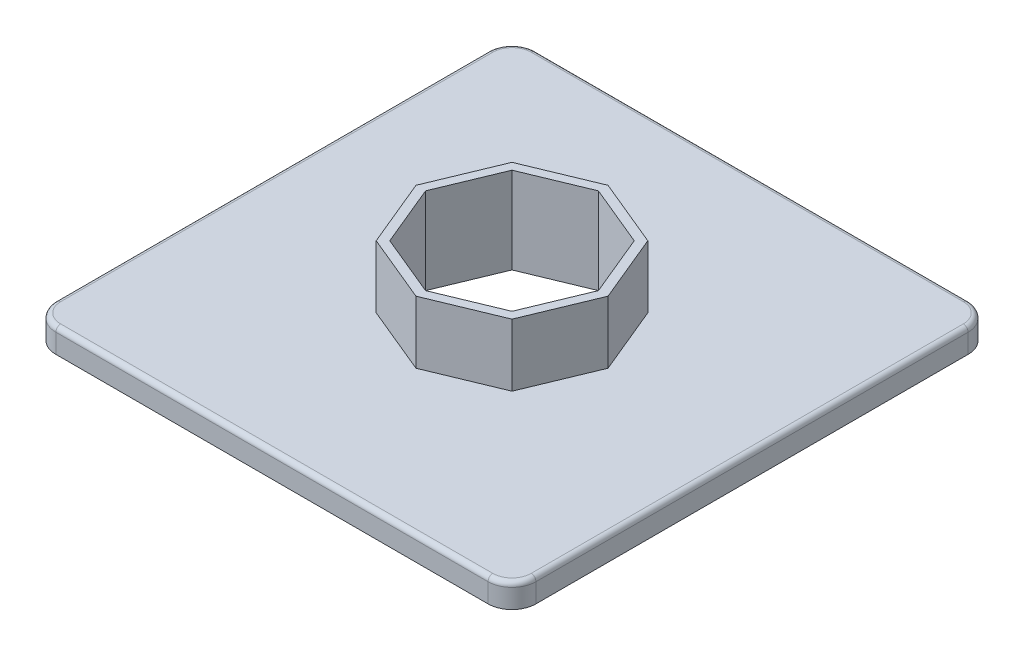
ISO-10303-21;
HEADER;
FILE_DESCRIPTION(('STEP AP214'),'2;1');
FILE_NAME('part.step','',(''),(''),'','','');
FILE_SCHEMA(('AUTOMOTIVE_DESIGN { 1 0 10303 214 1 1 1 1 }'));
ENDSEC;
DATA;
#1=APPLICATION_CONTEXT('core data for automotive mechanical design processes');
#2=APPLICATION_PROTOCOL_DEFINITION('international standard','automotive_design',2000,#1);
#3=PRODUCT_CONTEXT('',#1,'mechanical');
#4=PRODUCT('Part','Part','',(#3));
#5=PRODUCT_RELATED_PRODUCT_CATEGORY('part','',(#4));
#6=PRODUCT_DEFINITION_FORMATION('','',#4);
#7=PRODUCT_DEFINITION_CONTEXT('part definition',#1,'design');
#8=PRODUCT_DEFINITION('design','',#6,#7);
#9=PRODUCT_DEFINITION_SHAPE('','',#8);
#10=(LENGTH_UNIT() NAMED_UNIT(*) SI_UNIT(.MILLI.,.METRE.));
#11=(NAMED_UNIT(*) PLANE_ANGLE_UNIT() SI_UNIT($,.RADIAN.));
#12=(NAMED_UNIT(*) SI_UNIT($,.STERADIAN.) SOLID_ANGLE_UNIT());
#13=UNCERTAINTY_MEASURE_WITH_UNIT(LENGTH_MEASURE(1.E-05),#10,'distance_accuracy_value','');
#14=(GEOMETRIC_REPRESENTATION_CONTEXT(3) GLOBAL_UNCERTAINTY_ASSIGNED_CONTEXT((#13)) GLOBAL_UNIT_ASSIGNED_CONTEXT((#10,
#11,#12)) REPRESENTATION_CONTEXT('',''));
#15=CARTESIAN_POINT('',(0.,0.,0.));
#16=DIRECTION('',(0.,0.,1.));
#17=DIRECTION('',(1.,0.,0.));
#18=AXIS2_PLACEMENT_3D('',#15,#16,#17);
#19=CARTESIAN_POINT('',(95.,5.,-95.));
#20=DIRECTION('',(0.,1.,0.));
#21=DIRECTION('',(0.,0.,1.));
#22=AXIS2_PLACEMENT_3D('',#19,#20,#21);
#23=PLANE('',#22);
#24=CARTESIAN_POINT('',(5.,5.,-95.));
#25=DIRECTION('',(0.,1.,0.));
#26=DIRECTION('',(0.,0.,1.));
#27=AXIS2_PLACEMENT_3D('',#24,#25,#26);
#28=CIRCLE('',#27,4.);
#29=CARTESIAN_POINT('',(5.00000000000003,5.,-99.));
#30=VERTEX_POINT('',#29);
#31=CARTESIAN_POINT('',(0.999999999999997,5.,-95.));
#32=VERTEX_POINT('',#31);
#33=EDGE_CURVE('E402',#30,#32,#28,.T.);
#34=ORIENTED_EDGE('',*,*,#33,.T.);
#35=DIRECTION('',(0.,0.,1.));
#36=VECTOR('',#35,1.);
#37=CARTESIAN_POINT('',(1.,5.,-5.00000000000003));
#38=LINE('',#37,#36);
#39=CARTESIAN_POINT('',(1.,5.,-5.00000000000003));
#40=VERTEX_POINT('',#39);
#41=EDGE_CURVE('E401',#32,#40,#38,.T.);
#42=ORIENTED_EDGE('',*,*,#41,.T.);
#43=CARTESIAN_POINT('',(5.,5.,-5.));
#44=DIRECTION('',(0.,1.,0.));
#45=DIRECTION('',(0.,0.,1.));
#46=AXIS2_PLACEMENT_3D('',#43,#44,#45);
#47=CIRCLE('',#46,4.);
#48=CARTESIAN_POINT('',(5.00000000000004,5.,-1.));
#49=VERTEX_POINT('',#48);
#50=EDGE_CURVE('E386',#40,#49,#47,.T.);
#51=ORIENTED_EDGE('',*,*,#50,.T.);
#52=DIRECTION('',(1.,0.,0.));
#53=VECTOR('',#52,1.);
#54=CARTESIAN_POINT('',(95.,5.,-1.));
#55=LINE('',#54,#53);
#56=CARTESIAN_POINT('',(95.,5.,-1.));
#57=VERTEX_POINT('',#56);
#58=EDGE_CURVE('E391',#49,#57,#55,.T.);
#59=ORIENTED_EDGE('',*,*,#58,.T.);
#60=CARTESIAN_POINT('',(95.,5.,-5.));
#61=DIRECTION('',(0.,1.,0.));
#62=DIRECTION('',(0.,0.,1.));
#63=AXIS2_PLACEMENT_3D('',#60,#61,#62);
#64=CIRCLE('',#63,4.);
#65=CARTESIAN_POINT('',(99.,5.,-5.00000000000003));
#66=VERTEX_POINT('',#65);
#67=EDGE_CURVE('E394',#57,#66,#64,.T.);
#68=ORIENTED_EDGE('',*,*,#67,.T.);
#69=DIRECTION('',(0.,0.,-1.));
#70=VECTOR('',#69,1.);
#71=CARTESIAN_POINT('',(99.,5.,-95.));
#72=LINE('',#71,#70);
#73=CARTESIAN_POINT('',(99.,5.,-95.));
#74=VERTEX_POINT('',#73);
#75=EDGE_CURVE('E395',#66,#74,#72,.T.);
#76=ORIENTED_EDGE('',*,*,#75,.T.);
#77=CARTESIAN_POINT('',(95.,5.,-95.));
#78=DIRECTION('',(0.,1.,0.));
#79=DIRECTION('',(0.,0.,1.));
#80=AXIS2_PLACEMENT_3D('',#77,#78,#79);
#81=CIRCLE('',#80,4.);
#82=CARTESIAN_POINT('',(95.,5.,-99.));
#83=VERTEX_POINT('',#82);
#84=EDGE_CURVE('E396',#74,#83,#81,.T.);
#85=ORIENTED_EDGE('',*,*,#84,.T.);
#86=DIRECTION('',(-1.,0.,0.));
#87=VECTOR('',#86,1.);
#88=CARTESIAN_POINT('',(5.00000000000003,5.,-99.));
#89=LINE('',#88,#87);
#90=EDGE_CURVE('E398',#83,#30,#89,.T.);
#91=ORIENTED_EDGE('',*,*,#90,.T.);
#92=EDGE_LOOP('',(#34,#42,#51,#59,#68,#76,#85,#91));
#93=FACE_BOUND('',#92,.T.);
#94=DIRECTION('',(-0.3826834323651,0.,-0.923879532511283));
#95=VECTOR('',#94,1.);
#96=CARTESIAN_POINT('',(70.,5.,-50.0000000000002));
#97=LINE('',#96,#95);
#98=CARTESIAN_POINT('',(70.,5.,-50.0000000000002));
#99=VERTEX_POINT('',#98);
#100=CARTESIAN_POINT('',(64.1421356237308,5.,-64.1421356237311));
#101=VERTEX_POINT('',#100);
#102=EDGE_CURVE('E312',#99,#101,#97,.T.);
#103=ORIENTED_EDGE('',*,*,#102,.F.);
#104=DIRECTION('',(0.382683432365081,0.,-0.923879532511291));
#105=VECTOR('',#104,1.);
#106=CARTESIAN_POINT('',(64.1421356237311,5.,-35.8578643762692));
#107=LINE('',#106,#105);
#108=CARTESIAN_POINT('',(64.1421356237311,5.,-35.8578643762692));
#109=VERTEX_POINT('',#108);
#110=EDGE_CURVE('E237',#109,#99,#107,.T.);
#111=ORIENTED_EDGE('',*,*,#110,.F.);
#112=DIRECTION('',(0.923879532511283,0.,-0.3826834323651));
#113=VECTOR('',#112,1.);
#114=CARTESIAN_POINT('',(50.0000000000002,5.,-30.));
#115=LINE('',#114,#113);
#116=CARTESIAN_POINT('',(50.0000000000002,5.,-30.));
#117=VERTEX_POINT('',#116);
#118=EDGE_CURVE('E299',#117,#109,#115,.T.);
#119=ORIENTED_EDGE('',*,*,#118,.F.);
#120=DIRECTION('',(0.923879532511291,0.,0.382683432365079));
#121=VECTOR('',#120,1.);
#122=CARTESIAN_POINT('',(35.8578643762692,5.,-35.8578643762689));
#123=LINE('',#122,#121);
#124=CARTESIAN_POINT('',(35.8578643762692,5.,-35.8578643762689));
#125=VERTEX_POINT('',#124);
#126=EDGE_CURVE('E324',#125,#117,#123,.T.);
#127=ORIENTED_EDGE('',*,*,#126,.F.);
#128=DIRECTION('',(0.382683432365099,0.,0.923879532511283));
#129=VECTOR('',#128,1.);
#130=CARTESIAN_POINT('',(30.,5.,-49.9999999999998));
#131=LINE('',#130,#129);
#132=CARTESIAN_POINT('',(30.,5.,-49.9999999999998));
#133=VERTEX_POINT('',#132);
#134=EDGE_CURVE('E323',#133,#125,#131,.T.);
#135=ORIENTED_EDGE('',*,*,#134,.F.);
#136=DIRECTION('',(-0.38268343236508,0.,0.923879532511291));
#137=VECTOR('',#136,1.);
#138=CARTESIAN_POINT('',(35.8578643762689,5.,-64.1421356237308));
#139=LINE('',#138,#137);
#140=CARTESIAN_POINT('',(35.8578643762689,5.,-64.1421356237308));
#141=VERTEX_POINT('',#140);
#142=EDGE_CURVE('E321',#141,#133,#139,.T.);
#143=ORIENTED_EDGE('',*,*,#142,.F.);
#144=DIRECTION('',(-0.923879532511283,0.,0.382683432365099));
#145=VECTOR('',#144,1.);
#146=CARTESIAN_POINT('',(49.9999999999998,5.,-70.));
#147=LINE('',#146,#145);
#148=CARTESIAN_POINT('',(49.9999999999998,5.,-70.));
#149=VERTEX_POINT('',#148);
#150=EDGE_CURVE('E317',#149,#141,#147,.T.);
#151=ORIENTED_EDGE('',*,*,#150,.F.);
#152=DIRECTION('',(-0.923879532511291,0.,-0.38268343236508));
#153=VECTOR('',#152,1.);
#154=CARTESIAN_POINT('',(64.1421356237308,5.,-64.1421356237311));
#155=LINE('',#154,#153);
#156=EDGE_CURVE('E320',#101,#149,#155,.T.);
#157=ORIENTED_EDGE('',*,*,#156,.F.);
#158=EDGE_LOOP('',(#103,#111,#119,#127,#135,#143,#151,#157));
#159=FACE_BOUND('',#158,.T.);
#160=ADVANCED_FACE('F39',(#93,#159),#23,.T.);
#161=CARTESIAN_POINT('',(95.,5.,-95.));
#162=DIRECTION('',(0.,-1.,0.));
#163=DIRECTION('',(0.,0.,-1.));
#164=AXIS2_PLACEMENT_3D('',#161,#162,#163);
#165=CYLINDRICAL_SURFACE('',#164,5.);
#166=DIRECTION('',(0.,-1.,0.));
#167=VECTOR('',#166,1.);
#168=CARTESIAN_POINT('',(95.,5.,-100.));
#169=LINE('',#168,#167);
#170=CARTESIAN_POINT('',(95.,4.,-100.));
#171=VERTEX_POINT('',#170);
#172=CARTESIAN_POINT('',(95.,0.,-100.));
#173=VERTEX_POINT('',#172);
#174=EDGE_CURVE('E390',#171,#173,#169,.T.);
#175=ORIENTED_EDGE('',*,*,#174,.F.);
#176=CARTESIAN_POINT('',(95.,4.,-95.));
#177=DIRECTION('',(0.,1.,0.));
#178=DIRECTION('',(0.,0.,1.));
#179=AXIS2_PLACEMENT_3D('',#176,#177,#178);
#180=CIRCLE('',#179,5.);
#181=CARTESIAN_POINT('',(100.,4.,-95.));
#182=VERTEX_POINT('',#181);
#183=EDGE_CURVE('E415',#171,#182,#180,.F.);
#184=ORIENTED_EDGE('',*,*,#183,.T.);
#185=DIRECTION('',(0.,-1.,0.));
#186=VECTOR('',#185,1.);
#187=CARTESIAN_POINT('',(100.,5.,-95.));
#188=LINE('',#187,#186);
#189=CARTESIAN_POINT('',(100.,0.,-95.));
#190=VERTEX_POINT('',#189);
#191=EDGE_CURVE('E373',#182,#190,#188,.T.);
#192=ORIENTED_EDGE('',*,*,#191,.T.);
#193=CARTESIAN_POINT('',(95.,0.,-95.));
#194=DIRECTION('',(0.,1.,0.));
#195=DIRECTION('',(0.,0.,1.));
#196=AXIS2_PLACEMENT_3D('',#193,#194,#195);
#197=CIRCLE('',#196,5.);
#198=EDGE_CURVE('E349',#190,#173,#197,.T.);
#199=ORIENTED_EDGE('',*,*,#198,.T.);
#200=EDGE_LOOP('',(#175,#184,#192,#199));
#201=FACE_BOUND('',#200,.T.);
#202=ADVANCED_FACE('F465',(#201),#165,.T.);
#203=CARTESIAN_POINT('',(5.00000000000004,5.,-100.));
#204=DIRECTION('',(0.,0.,1.));
#205=DIRECTION('',(1.,0.,0.));
#206=AXIS2_PLACEMENT_3D('',#203,#204,#205);
#207=PLANE('',#206);
#208=DIRECTION('',(0.,-1.,0.));
#209=VECTOR('',#208,1.);
#210=CARTESIAN_POINT('',(5.00000000000004,5.,-100.));
#211=LINE('',#210,#209);
#212=CARTESIAN_POINT('',(5.00000000000004,4.,-100.));
#213=VERTEX_POINT('',#212);
#214=CARTESIAN_POINT('',(5.00000000000004,0.,-100.));
#215=VERTEX_POINT('',#214);
#216=EDGE_CURVE('E384',#213,#215,#211,.T.);
#217=ORIENTED_EDGE('',*,*,#216,.F.);
#218=DIRECTION('',(-1.,0.,0.));
#219=VECTOR('',#218,1.);
#220=CARTESIAN_POINT('',(95.,4.,-100.));
#221=LINE('',#220,#219);
#222=EDGE_CURVE('E414',#213,#171,#221,.F.);
#223=ORIENTED_EDGE('',*,*,#222,.T.);
#224=ORIENTED_EDGE('',*,*,#174,.T.);
#225=DIRECTION('',(-1.,0.,0.));
#226=VECTOR('',#225,1.);
#227=CARTESIAN_POINT('',(5.00000000000004,0.,-100.));
#228=LINE('',#227,#226);
#229=EDGE_CURVE('E352',#173,#215,#228,.T.);
#230=ORIENTED_EDGE('',*,*,#229,.T.);
#231=EDGE_LOOP('',(#217,#223,#224,#230));
#232=FACE_BOUND('',#231,.T.);
#233=ADVANCED_FACE('F470',(#232),#207,.F.);
#234=CARTESIAN_POINT('',(5.,5.,-95.));
#235=DIRECTION('',(0.,-1.,0.));
#236=DIRECTION('',(0.,0.,-1.));
#237=AXIS2_PLACEMENT_3D('',#234,#235,#236);
#238=CYLINDRICAL_SURFACE('',#237,5.);
#239=DIRECTION('',(0.,-1.,0.));
#240=VECTOR('',#239,1.);
#241=CARTESIAN_POINT('',(0.,5.,-95.));
#242=LINE('',#241,#240);
#243=CARTESIAN_POINT('',(0.,4.,-95.));
#244=VERTEX_POINT('',#243);
#245=CARTESIAN_POINT('',(0.,0.,-95.));
#246=VERTEX_POINT('',#245);
#247=EDGE_CURVE('E382',#244,#246,#242,.T.);
#248=ORIENTED_EDGE('',*,*,#247,.F.);
#249=CARTESIAN_POINT('',(5.,4.,-95.));
#250=DIRECTION('',(0.,1.,0.));
#251=DIRECTION('',(0.,0.,1.));
#252=AXIS2_PLACEMENT_3D('',#249,#250,#251);
#253=CIRCLE('',#252,5.);
#254=EDGE_CURVE('E408',#244,#213,#253,.F.);
#255=ORIENTED_EDGE('',*,*,#254,.T.);
#256=ORIENTED_EDGE('',*,*,#216,.T.);
#257=CARTESIAN_POINT('',(5.,0.,-95.));
#258=DIRECTION('',(0.,1.,0.));
#259=DIRECTION('',(0.,0.,1.));
#260=AXIS2_PLACEMENT_3D('',#257,#258,#259);
#261=CIRCLE('',#260,5.);
#262=EDGE_CURVE('E355',#215,#246,#261,.T.);
#263=ORIENTED_EDGE('',*,*,#262,.T.);
#264=EDGE_LOOP('',(#248,#255,#256,#263));
#265=FACE_BOUND('',#264,.T.);
#266=ADVANCED_FACE('F504',(#265),#238,.T.);
#267=CARTESIAN_POINT('',(0.,5.,-5.00000000000004));
#268=DIRECTION('',(1.,0.,0.));
#269=DIRECTION('',(0.,0.,-1.));
#270=AXIS2_PLACEMENT_3D('',#267,#268,#269);
#271=PLANE('',#270);
#272=DIRECTION('',(0.,-1.,0.));
#273=VECTOR('',#272,1.);
#274=CARTESIAN_POINT('',(0.,5.,-5.00000000000003));
#275=LINE('',#274,#273);
#276=CARTESIAN_POINT('',(0.,4.,-5.00000000000003));
#277=VERTEX_POINT('',#276);
#278=CARTESIAN_POINT('',(0.,0.,-5.00000000000003));
#279=VERTEX_POINT('',#278);
#280=EDGE_CURVE('E381',#277,#279,#275,.T.);
#281=ORIENTED_EDGE('',*,*,#280,.F.);
#282=DIRECTION('',(0.,0.,1.));
#283=VECTOR('',#282,1.);
#284=CARTESIAN_POINT('',(0.,4.,-95.));
#285=LINE('',#284,#283);
#286=EDGE_CURVE('E406',#277,#244,#285,.F.);
#287=ORIENTED_EDGE('',*,*,#286,.T.);
#288=ORIENTED_EDGE('',*,*,#247,.T.);
#289=DIRECTION('',(0.,0.,1.));
#290=VECTOR('',#289,1.);
#291=CARTESIAN_POINT('',(0.,0.,-5.00000000000004));
#292=LINE('',#291,#290);
#293=EDGE_CURVE('E360',#246,#279,#292,.T.);
#294=ORIENTED_EDGE('',*,*,#293,.T.);
#295=EDGE_LOOP('',(#281,#287,#288,#294));
#296=FACE_BOUND('',#295,.T.);
#297=ADVANCED_FACE('F496',(#296),#271,.F.);
#298=CARTESIAN_POINT('',(5.,5.,-5.));
#299=DIRECTION('',(0.,-1.,0.));
#300=DIRECTION('',(0.,0.,-1.));
#301=AXIS2_PLACEMENT_3D('',#298,#299,#300);
#302=CYLINDRICAL_SURFACE('',#301,5.);
#303=DIRECTION('',(0.,-1.,0.));
#304=VECTOR('',#303,1.);
#305=CARTESIAN_POINT('',(5.00000000000004,5.,0.));
#306=LINE('',#305,#304);
#307=CARTESIAN_POINT('',(5.00000000000004,4.,0.));
#308=VERTEX_POINT('',#307);
#309=CARTESIAN_POINT('',(5.00000000000004,0.,0.));
#310=VERTEX_POINT('',#309);
#311=EDGE_CURVE('E377',#308,#310,#306,.T.);
#312=ORIENTED_EDGE('',*,*,#311,.F.);
#313=CARTESIAN_POINT('',(5.,4.,-5.));
#314=DIRECTION('',(0.,1.,0.));
#315=DIRECTION('',(0.,0.,1.));
#316=AXIS2_PLACEMENT_3D('',#313,#314,#315);
#317=CIRCLE('',#316,5.);
#318=EDGE_CURVE('E11',#308,#277,#317,.F.);
#319=ORIENTED_EDGE('',*,*,#318,.T.);
#320=ORIENTED_EDGE('',*,*,#280,.T.);
#321=CARTESIAN_POINT('',(5.,0.,-5.));
#322=DIRECTION('',(0.,1.,0.));
#323=DIRECTION('',(0.,0.,-1.));
#324=AXIS2_PLACEMENT_3D('',#321,#322,#323);
#325=CIRCLE('',#324,5.);
#326=EDGE_CURVE('E363',#279,#310,#325,.T.);
#327=ORIENTED_EDGE('',*,*,#326,.T.);
#328=EDGE_LOOP('',(#312,#319,#320,#327));
#329=FACE_BOUND('',#328,.T.);
#330=ADVANCED_FACE('F493',(#329),#302,.T.);
#331=CARTESIAN_POINT('',(5.00000000000004,5.,0.));
#332=DIRECTION('',(0.,0.,-1.));
#333=DIRECTION('',(-1.,0.,0.));
#334=AXIS2_PLACEMENT_3D('',#331,#332,#333);
#335=PLANE('',#334);
#336=DIRECTION('',(0.,-1.,0.));
#337=VECTOR('',#336,1.);
#338=CARTESIAN_POINT('',(95.,5.,0.));
#339=LINE('',#338,#337);
#340=CARTESIAN_POINT('',(95.,4.,0.));
#341=VERTEX_POINT('',#340);
#342=CARTESIAN_POINT('',(95.,0.,0.));
#343=VERTEX_POINT('',#342);
#344=EDGE_CURVE('E380',#341,#343,#339,.T.);
#345=ORIENTED_EDGE('',*,*,#344,.F.);
#346=DIRECTION('',(1.,0.,0.));
#347=VECTOR('',#346,1.);
#348=CARTESIAN_POINT('',(5.00000000000003,4.,0.));
#349=LINE('',#348,#347);
#350=EDGE_CURVE('E48',#341,#308,#349,.F.);
#351=ORIENTED_EDGE('',*,*,#350,.T.);
#352=ORIENTED_EDGE('',*,*,#311,.T.);
#353=DIRECTION('',(1.,0.,0.));
#354=VECTOR('',#353,1.);
#355=CARTESIAN_POINT('',(5.00000000000004,0.,0.));
#356=LINE('',#355,#354);
#357=EDGE_CURVE('E365',#310,#343,#356,.T.);
#358=ORIENTED_EDGE('',*,*,#357,.T.);
#359=EDGE_LOOP('',(#345,#351,#352,#358));
#360=FACE_BOUND('',#359,.T.);
#361=ADVANCED_FACE('F495',(#360),#335,.F.);
#362=CARTESIAN_POINT('',(95.,5.,-5.));
#363=DIRECTION('',(0.,-1.,0.));
#364=DIRECTION('',(0.,0.,-1.));
#365=AXIS2_PLACEMENT_3D('',#362,#363,#364);
#366=CYLINDRICAL_SURFACE('',#365,5.);
#367=DIRECTION('',(0.,-1.,0.));
#368=VECTOR('',#367,1.);
#369=CARTESIAN_POINT('',(100.,5.,-5.00000000000003));
#370=LINE('',#369,#368);
#371=CARTESIAN_POINT('',(100.,4.,-5.00000000000003));
#372=VERTEX_POINT('',#371);
#373=CARTESIAN_POINT('',(100.,0.,-5.00000000000003));
#374=VERTEX_POINT('',#373);
#375=EDGE_CURVE('E374',#372,#374,#370,.T.);
#376=ORIENTED_EDGE('',*,*,#375,.F.);
#377=CARTESIAN_POINT('',(95.,4.,-5.));
#378=DIRECTION('',(0.,1.,0.));
#379=DIRECTION('',(0.,0.,1.));
#380=AXIS2_PLACEMENT_3D('',#377,#378,#379);
#381=CIRCLE('',#380,5.);
#382=EDGE_CURVE('E417',#372,#341,#381,.F.);
#383=ORIENTED_EDGE('',*,*,#382,.T.);
#384=ORIENTED_EDGE('',*,*,#344,.T.);
#385=CARTESIAN_POINT('',(95.,0.,-5.));
#386=DIRECTION('',(0.,1.,0.));
#387=DIRECTION('',(0.,0.,1.));
#388=AXIS2_PLACEMENT_3D('',#385,#386,#387);
#389=CIRCLE('',#388,5.);
#390=EDGE_CURVE('E370',#343,#374,#389,.T.);
#391=ORIENTED_EDGE('',*,*,#390,.T.);
#392=EDGE_LOOP('',(#376,#383,#384,#391));
#393=FACE_BOUND('',#392,.T.);
#394=ADVANCED_FACE('F452',(#393),#366,.T.);
#395=CARTESIAN_POINT('',(100.,5.,-5.00000000000003));
#396=DIRECTION('',(-1.,0.,0.));
#397=DIRECTION('',(0.,0.,1.));
#398=AXIS2_PLACEMENT_3D('',#395,#396,#397);
#399=PLANE('',#398);
#400=ORIENTED_EDGE('',*,*,#191,.F.);
#401=DIRECTION('',(0.,0.,-1.));
#402=VECTOR('',#401,1.);
#403=CARTESIAN_POINT('',(100.,4.,-5.00000000000003));
#404=LINE('',#403,#402);
#405=EDGE_CURVE('E412',#182,#372,#404,.F.);
#406=ORIENTED_EDGE('',*,*,#405,.T.);
#407=ORIENTED_EDGE('',*,*,#375,.T.);
#408=DIRECTION('',(0.,0.,-1.));
#409=VECTOR('',#408,1.);
#410=CARTESIAN_POINT('',(100.,0.,-5.00000000000003));
#411=LINE('',#410,#409);
#412=EDGE_CURVE('E367',#374,#190,#411,.T.);
#413=ORIENTED_EDGE('',*,*,#412,.T.);
#414=EDGE_LOOP('',(#400,#406,#407,#413));
#415=FACE_BOUND('',#414,.T.);
#416=ADVANCED_FACE('F455',(#415),#399,.F.);
#417=CARTESIAN_POINT('',(95.,0.,-95.));
#418=DIRECTION('',(0.,1.,0.));
#419=DIRECTION('',(0.,0.,1.));
#420=AXIS2_PLACEMENT_3D('',#417,#418,#419);
#421=PLANE('',#420);
#422=DIRECTION('',(0.923879532511284,0.,-0.382683432365096));
#423=VECTOR('',#422,1.);
#424=CARTESIAN_POINT('',(50.0000000000001,0.,-31.9999999999999));
#425=LINE('',#424,#423);
#426=CARTESIAN_POINT('',(50.0000000000001,0.,-31.9999999999999));
#427=VERTEX_POINT('',#426);
#428=CARTESIAN_POINT('',(62.7279220613579,0.,-37.2720779386421));
#429=VERTEX_POINT('',#428);
#430=EDGE_CURVE('E248',#427,#429,#425,.T.);
#431=ORIENTED_EDGE('',*,*,#430,.T.);
#432=DIRECTION('',(0.382683432365083,0.,-0.92387953251129));
#433=VECTOR('',#432,1.);
#434=CARTESIAN_POINT('',(62.7279220613579,0.,-37.2720779386421));
#435=LINE('',#434,#433);
#436=CARTESIAN_POINT('',(68.,0.,-50.));
#437=VERTEX_POINT('',#436);
#438=EDGE_CURVE('E234',#429,#437,#435,.T.);
#439=ORIENTED_EDGE('',*,*,#438,.T.);
#440=DIRECTION('',(-0.382683432365095,0.,-0.923879532511285));
#441=VECTOR('',#440,1.);
#442=CARTESIAN_POINT('',(68.,0.,-50.));
#443=LINE('',#442,#441);
#444=CARTESIAN_POINT('',(62.7279220613578,0.,-62.7279220613578));
#445=VERTEX_POINT('',#444);
#446=EDGE_CURVE('E239',#437,#445,#443,.T.);
#447=ORIENTED_EDGE('',*,*,#446,.T.);
#448=DIRECTION('',(-0.92387953251129,0.,-0.382683432365083));
#449=VECTOR('',#448,1.);
#450=CARTESIAN_POINT('',(62.7279220613578,0.,-62.7279220613578));
#451=LINE('',#450,#449);
#452=CARTESIAN_POINT('',(49.9999999999999,0.,-67.9999999999999));
#453=VERTEX_POINT('',#452);
#454=EDGE_CURVE('E244',#445,#453,#451,.T.);
#455=ORIENTED_EDGE('',*,*,#454,.T.);
#456=DIRECTION('',(-0.923879532511284,0.,0.382683432365096));
#457=VECTOR('',#456,1.);
#458=CARTESIAN_POINT('',(49.9999999999999,0.,-67.9999999999999));
#459=LINE('',#458,#457);
#460=CARTESIAN_POINT('',(37.2720779386421,0.,-62.7279220613577));
#461=VERTEX_POINT('',#460);
#462=EDGE_CURVE('E251',#453,#461,#459,.T.);
#463=ORIENTED_EDGE('',*,*,#462,.T.);
#464=DIRECTION('',(-0.382683432365083,0.,0.92387953251129));
#465=VECTOR('',#464,1.);
#466=CARTESIAN_POINT('',(37.2720779386421,0.,-62.7279220613577));
#467=LINE('',#466,#465);
#468=CARTESIAN_POINT('',(32.,0.,-49.9999999999998));
#469=VERTEX_POINT('',#468);
#470=EDGE_CURVE('E258',#461,#469,#467,.T.);
#471=ORIENTED_EDGE('',*,*,#470,.T.);
#472=DIRECTION('',(0.382683432365096,0.,0.923879532511284));
#473=VECTOR('',#472,1.);
#474=CARTESIAN_POINT('',(32.,0.,-49.9999999999998));
#475=LINE('',#474,#473);
#476=CARTESIAN_POINT('',(37.2720779386422,0.,-37.272077938642));
#477=VERTEX_POINT('',#476);
#478=EDGE_CURVE('E259',#469,#477,#475,.T.);
#479=ORIENTED_EDGE('',*,*,#478,.T.);
#480=DIRECTION('',(0.92387953251129,0.,0.382683432365083));
#481=VECTOR('',#480,1.);
#482=CARTESIAN_POINT('',(37.2720779386422,0.,-37.272077938642));
#483=LINE('',#482,#481);
#484=EDGE_CURVE('E265',#477,#427,#483,.T.);
#485=ORIENTED_EDGE('',*,*,#484,.T.);
#486=EDGE_LOOP('',(#431,#439,#447,#455,#463,#471,#479,#485));
#487=FACE_BOUND('',#486,.T.);
#488=ORIENTED_EDGE('',*,*,#198,.F.);
#489=ORIENTED_EDGE('',*,*,#412,.F.);
#490=ORIENTED_EDGE('',*,*,#390,.F.);
#491=ORIENTED_EDGE('',*,*,#357,.F.);
#492=ORIENTED_EDGE('',*,*,#326,.F.);
#493=ORIENTED_EDGE('',*,*,#293,.F.);
#494=ORIENTED_EDGE('',*,*,#262,.F.);
#495=ORIENTED_EDGE('',*,*,#229,.F.);
#496=EDGE_LOOP('',(#488,#489,#490,#491,#492,#493,#494,#495));
#497=FACE_BOUND('',#496,.T.);
#498=ADVANCED_FACE('F245',(#487,#497),#421,.F.);
#499=CARTESIAN_POINT('',(99.,4.,-95.));
#500=DIRECTION('',(0.,0.,1.));
#501=DIRECTION('',(1.,0.,0.));
#502=AXIS2_PLACEMENT_3D('',#499,#500,#501);
#503=CYLINDRICAL_SURFACE('',#502,1.);
#504=CARTESIAN_POINT('',(99.,4.,-5.00000000000003));
#505=DIRECTION('',(0.,0.,1.));
#506=DIRECTION('',(1.,0.,0.));
#507=AXIS2_PLACEMENT_3D('',#504,#505,#506);
#508=CIRCLE('',#507,1.);
#509=EDGE_CURVE('E432',#372,#66,#508,.T.);
#510=ORIENTED_EDGE('',*,*,#509,.F.);
#511=ORIENTED_EDGE('',*,*,#405,.F.);
#512=CARTESIAN_POINT('',(99.,4.,-95.));
#513=DIRECTION('',(0.,0.,-1.));
#514=DIRECTION('',(-1.,0.,0.));
#515=AXIS2_PLACEMENT_3D('',#512,#513,#514);
#516=CIRCLE('',#515,1.);
#517=EDGE_CURVE('E43',#74,#182,#516,.T.);
#518=ORIENTED_EDGE('',*,*,#517,.F.);
#519=ORIENTED_EDGE('',*,*,#75,.F.);
#520=EDGE_LOOP('',(#510,#511,#518,#519));
#521=FACE_BOUND('',#520,.T.);
#522=ADVANCED_FACE('F41',(#521),#503,.T.);
#523=CARTESIAN_POINT('',(95.,4.,-95.));
#524=DIRECTION('',(0.,1.,0.));
#525=DIRECTION('',(0.,0.,1.));
#526=AXIS2_PLACEMENT_3D('',#523,#524,#525);
#527=TOROIDAL_SURFACE('',#526,4.,1.);
#528=ORIENTED_EDGE('',*,*,#517,.T.);
#529=ORIENTED_EDGE('',*,*,#183,.F.);
#530=CARTESIAN_POINT('',(95.,4.,-99.));
#531=DIRECTION('',(-1.,0.,0.));
#532=DIRECTION('',(0.,0.,1.));
#533=AXIS2_PLACEMENT_3D('',#530,#531,#532);
#534=CIRCLE('',#533,1.);
#535=EDGE_CURVE('E435',#83,#171,#534,.T.);
#536=ORIENTED_EDGE('',*,*,#535,.F.);
#537=ORIENTED_EDGE('',*,*,#84,.F.);
#538=EDGE_LOOP('',(#528,#529,#536,#537));
#539=FACE_BOUND('',#538,.T.);
#540=ADVANCED_FACE('F443',(#539),#527,.T.);
#541=CARTESIAN_POINT('',(95.,4.,-5.));
#542=DIRECTION('',(0.,1.,0.));
#543=DIRECTION('',(0.,0.,1.));
#544=AXIS2_PLACEMENT_3D('',#541,#542,#543);
#545=TOROIDAL_SURFACE('',#544,4.,1.);
#546=ORIENTED_EDGE('',*,*,#509,.T.);
#547=ORIENTED_EDGE('',*,*,#67,.F.);
#548=CARTESIAN_POINT('',(95.,4.,-0.999999999999997));
#549=DIRECTION('',(-1.,0.,0.));
#550=DIRECTION('',(0.,0.,1.));
#551=AXIS2_PLACEMENT_3D('',#548,#549,#550);
#552=CIRCLE('',#551,1.);
#553=EDGE_CURVE('E427',#341,#57,#552,.T.);
#554=ORIENTED_EDGE('',*,*,#553,.F.);
#555=ORIENTED_EDGE('',*,*,#382,.F.);
#556=EDGE_LOOP('',(#546,#547,#554,#555));
#557=FACE_BOUND('',#556,.T.);
#558=ADVANCED_FACE('F482',(#557),#545,.T.);
#559=CARTESIAN_POINT('',(95.,4.,-99.));
#560=DIRECTION('',(1.,0.,0.));
#561=DIRECTION('',(0.,0.,-1.));
#562=AXIS2_PLACEMENT_3D('',#559,#560,#561);
#563=CYLINDRICAL_SURFACE('',#562,1.);
#564=ORIENTED_EDGE('',*,*,#535,.T.);
#565=ORIENTED_EDGE('',*,*,#222,.F.);
#566=CARTESIAN_POINT('',(5.00000000000003,4.,-99.));
#567=DIRECTION('',(-1.,0.,0.));
#568=DIRECTION('',(0.,0.,1.));
#569=AXIS2_PLACEMENT_3D('',#566,#567,#568);
#570=CIRCLE('',#569,1.);
#571=EDGE_CURVE('E426',#30,#213,#570,.T.);
#572=ORIENTED_EDGE('',*,*,#571,.F.);
#573=ORIENTED_EDGE('',*,*,#90,.F.);
#574=EDGE_LOOP('',(#564,#565,#572,#573));
#575=FACE_BOUND('',#574,.T.);
#576=ADVANCED_FACE('F472',(#575),#563,.T.);
#577=CARTESIAN_POINT('',(95.,4.,-1.));
#578=DIRECTION('',(-1.,0.,0.));
#579=DIRECTION('',(0.,0.,1.));
#580=AXIS2_PLACEMENT_3D('',#577,#578,#579);
#581=CYLINDRICAL_SURFACE('',#580,1.);
#582=ORIENTED_EDGE('',*,*,#553,.T.);
#583=ORIENTED_EDGE('',*,*,#58,.F.);
#584=CARTESIAN_POINT('',(5.00000000000004,4.,-1.));
#585=DIRECTION('',(-1.,0.,0.));
#586=DIRECTION('',(0.,0.,1.));
#587=AXIS2_PLACEMENT_3D('',#584,#585,#586);
#588=CIRCLE('',#587,1.);
#589=EDGE_CURVE('E421',#308,#49,#588,.T.);
#590=ORIENTED_EDGE('',*,*,#589,.F.);
#591=ORIENTED_EDGE('',*,*,#350,.F.);
#592=EDGE_LOOP('',(#582,#583,#590,#591));
#593=FACE_BOUND('',#592,.T.);
#594=ADVANCED_FACE('F490',(#593),#581,.T.);
#595=CARTESIAN_POINT('',(5.,4.,-95.));
#596=DIRECTION('',(0.,1.,0.));
#597=DIRECTION('',(0.,0.,1.));
#598=AXIS2_PLACEMENT_3D('',#595,#596,#597);
#599=TOROIDAL_SURFACE('',#598,4.,1.);
#600=ORIENTED_EDGE('',*,*,#571,.T.);
#601=ORIENTED_EDGE('',*,*,#254,.F.);
#602=CARTESIAN_POINT('',(0.999999999999997,4.,-95.));
#603=DIRECTION('',(0.,0.,1.));
#604=DIRECTION('',(1.,0.,0.));
#605=AXIS2_PLACEMENT_3D('',#602,#603,#604);
#606=CIRCLE('',#605,1.);
#607=EDGE_CURVE('E423',#32,#244,#606,.T.);
#608=ORIENTED_EDGE('',*,*,#607,.F.);
#609=ORIENTED_EDGE('',*,*,#33,.F.);
#610=EDGE_LOOP('',(#600,#601,#608,#609));
#611=FACE_BOUND('',#610,.T.);
#612=ADVANCED_FACE('F480',(#611),#599,.T.);
#613=CARTESIAN_POINT('',(5.,4.,-5.));
#614=DIRECTION('',(0.,1.,0.));
#615=DIRECTION('',(0.,0.,1.));
#616=AXIS2_PLACEMENT_3D('',#613,#614,#615);
#617=TOROIDAL_SURFACE('',#616,4.,1.);
#618=ORIENTED_EDGE('',*,*,#589,.T.);
#619=ORIENTED_EDGE('',*,*,#50,.F.);
#620=CARTESIAN_POINT('',(1.,4.,-5.00000000000003));
#621=DIRECTION('',(0.,0.,-1.));
#622=DIRECTION('',(-1.,0.,0.));
#623=AXIS2_PLACEMENT_3D('',#620,#621,#622);
#624=CIRCLE('',#623,1.);
#625=EDGE_CURVE('E346',#277,#40,#624,.T.);
#626=ORIENTED_EDGE('',*,*,#625,.F.);
#627=ORIENTED_EDGE('',*,*,#318,.F.);
#628=EDGE_LOOP('',(#618,#619,#626,#627));
#629=FACE_BOUND('',#628,.T.);
#630=ADVANCED_FACE('F593',(#629),#617,.T.);
#631=CARTESIAN_POINT('',(1.,4.,-95.));
#632=DIRECTION('',(0.,0.,-1.));
#633=DIRECTION('',(-1.,0.,0.));
#634=AXIS2_PLACEMENT_3D('',#631,#632,#633);
#635=CYLINDRICAL_SURFACE('',#634,1.);
#636=ORIENTED_EDGE('',*,*,#607,.T.);
#637=ORIENTED_EDGE('',*,*,#286,.F.);
#638=ORIENTED_EDGE('',*,*,#625,.T.);
#639=ORIENTED_EDGE('',*,*,#41,.F.);
#640=EDGE_LOOP('',(#636,#637,#638,#639));
#641=FACE_BOUND('',#640,.T.);
#642=ADVANCED_FACE('F599',(#641),#635,.T.);
#643=CARTESIAN_POINT('',(0.,18.,0.));
#644=DIRECTION('',(0.,1.,0.));
#645=DIRECTION('',(0.,0.,1.));
#646=AXIS2_PLACEMENT_3D('',#643,#644,#645);
#647=PLANE('',#646);
#648=DIRECTION('',(0.382683432365081,0.,-0.923879532511291));
#649=VECTOR('',#648,1.);
#650=CARTESIAN_POINT('',(64.1421356237311,18.,-35.8578643762692));
#651=LINE('',#650,#649);
#652=CARTESIAN_POINT('',(64.1421356237311,18.,-35.8578643762692));
#653=VERTEX_POINT('',#652);
#654=CARTESIAN_POINT('',(70.,18.,-50.0000000000002));
#655=VERTEX_POINT('',#654);
#656=EDGE_CURVE('E294',#653,#655,#651,.T.);
#657=ORIENTED_EDGE('',*,*,#656,.T.);
#658=DIRECTION('',(-0.3826834323651,0.,-0.923879532511283));
#659=VECTOR('',#658,1.);
#660=CARTESIAN_POINT('',(70.,18.,-50.0000000000002));
#661=LINE('',#660,#659);
#662=CARTESIAN_POINT('',(64.1421356237308,18.,-64.1421356237311));
#663=VERTEX_POINT('',#662);
#664=EDGE_CURVE('E297',#655,#663,#661,.T.);
#665=ORIENTED_EDGE('',*,*,#664,.T.);
#666=DIRECTION('',(-0.923879532511291,0.,-0.38268343236508));
#667=VECTOR('',#666,1.);
#668=CARTESIAN_POINT('',(64.1421356237308,18.,-64.1421356237311));
#669=LINE('',#668,#667);
#670=CARTESIAN_POINT('',(49.9999999999998,18.,-70.));
#671=VERTEX_POINT('',#670);
#672=EDGE_CURVE('E300',#663,#671,#669,.T.);
#673=ORIENTED_EDGE('',*,*,#672,.T.);
#674=DIRECTION('',(-0.923879532511283,0.,0.382683432365099));
#675=VECTOR('',#674,1.);
#676=CARTESIAN_POINT('',(49.9999999999998,18.,-70.));
#677=LINE('',#676,#675);
#678=CARTESIAN_POINT('',(35.8578643762689,18.,-64.1421356237308));
#679=VERTEX_POINT('',#678);
#680=EDGE_CURVE('E301',#671,#679,#677,.T.);
#681=ORIENTED_EDGE('',*,*,#680,.T.);
#682=DIRECTION('',(-0.38268343236508,0.,0.923879532511291));
#683=VECTOR('',#682,1.);
#684=CARTESIAN_POINT('',(35.8578643762689,18.,-64.1421356237308));
#685=LINE('',#684,#683);
#686=CARTESIAN_POINT('',(30.,18.,-49.9999999999998));
#687=VERTEX_POINT('',#686);
#688=EDGE_CURVE('E303',#679,#687,#685,.T.);
#689=ORIENTED_EDGE('',*,*,#688,.T.);
#690=DIRECTION('',(0.382683432365099,0.,0.923879532511283));
#691=VECTOR('',#690,1.);
#692=CARTESIAN_POINT('',(30.,18.,-49.9999999999998));
#693=LINE('',#692,#691);
#694=CARTESIAN_POINT('',(35.8578643762692,18.,-35.8578643762689));
#695=VERTEX_POINT('',#694);
#696=EDGE_CURVE('E308',#687,#695,#693,.T.);
#697=ORIENTED_EDGE('',*,*,#696,.T.);
#698=DIRECTION('',(0.923879532511291,0.,0.382683432365079));
#699=VECTOR('',#698,1.);
#700=CARTESIAN_POINT('',(35.8578643762692,18.,-35.8578643762689));
#701=LINE('',#700,#699);
#702=CARTESIAN_POINT('',(50.0000000000002,18.,-30.));
#703=VERTEX_POINT('',#702);
#704=EDGE_CURVE('E306',#695,#703,#701,.T.);
#705=ORIENTED_EDGE('',*,*,#704,.T.);
#706=DIRECTION('',(0.923879532511283,0.,-0.3826834323651));
#707=VECTOR('',#706,1.);
#708=CARTESIAN_POINT('',(50.0000000000002,18.,-30.));
#709=LINE('',#708,#707);
#710=EDGE_CURVE('E309',#703,#653,#709,.T.);
#711=ORIENTED_EDGE('',*,*,#710,.T.);
#712=EDGE_LOOP('',(#657,#665,#673,#681,#689,#697,#705,#711));
#713=FACE_BOUND('',#712,.T.);
#714=DIRECTION('',(-0.382683432365095,0.,-0.923879532511284));
#715=VECTOR('',#714,1.);
#716=CARTESIAN_POINT('',(68.,18.,-50.0000000000001));
#717=LINE('',#716,#715);
#718=CARTESIAN_POINT('',(68.,18.,-50.0000000000001));
#719=VERTEX_POINT('',#718);
#720=CARTESIAN_POINT('',(62.7279220613578,18.,-62.7279220613579));
#721=VERTEX_POINT('',#720);
#722=EDGE_CURVE('E266',#719,#721,#717,.T.);
#723=ORIENTED_EDGE('',*,*,#722,.F.);
#724=DIRECTION('',(0.382683432365084,0.,-0.923879532511289));
#725=VECTOR('',#724,1.);
#726=CARTESIAN_POINT('',(62.7279220613579,18.,-37.2720779386422));
#727=LINE('',#726,#725);
#728=CARTESIAN_POINT('',(62.7279220613579,18.,-37.2720779386422));
#729=VERTEX_POINT('',#728);
#730=EDGE_CURVE('E233',#729,#719,#727,.T.);
#731=ORIENTED_EDGE('',*,*,#730,.F.);
#732=DIRECTION('',(0.923879532511285,0.,-0.382683432365095));
#733=VECTOR('',#732,1.);
#734=CARTESIAN_POINT('',(50.0000000000001,18.,-32.));
#735=LINE('',#734,#733);
#736=CARTESIAN_POINT('',(50.0000000000001,18.,-32.));
#737=VERTEX_POINT('',#736);
#738=EDGE_CURVE('E276',#737,#729,#735,.T.);
#739=ORIENTED_EDGE('',*,*,#738,.F.);
#740=DIRECTION('',(0.923879532511289,0.,0.382683432365084));
#741=VECTOR('',#740,1.);
#742=CARTESIAN_POINT('',(37.2720779386422,18.,-37.2720779386421));
#743=LINE('',#742,#741);
#744=CARTESIAN_POINT('',(37.2720779386422,18.,-37.2720779386421));
#745=VERTEX_POINT('',#744);
#746=EDGE_CURVE('E277',#745,#737,#743,.T.);
#747=ORIENTED_EDGE('',*,*,#746,.F.);
#748=DIRECTION('',(0.382683432365095,0.,0.923879532511285));
#749=VECTOR('',#748,1.);
#750=CARTESIAN_POINT('',(32.,18.,-49.9999999999999));
#751=LINE('',#750,#749);
#752=CARTESIAN_POINT('',(32.,18.,-49.9999999999999));
#753=VERTEX_POINT('',#752);
#754=EDGE_CURVE('E273',#753,#745,#751,.T.);
#755=ORIENTED_EDGE('',*,*,#754,.F.);
#756=DIRECTION('',(-0.382683432365084,0.,0.923879532511289));
#757=VECTOR('',#756,1.);
#758=CARTESIAN_POINT('',(37.2720779386421,18.,-62.7279220613578));
#759=LINE('',#758,#757);
#760=CARTESIAN_POINT('',(37.2720779386421,18.,-62.7279220613578));
#761=VERTEX_POINT('',#760);
#762=EDGE_CURVE('E275',#761,#753,#759,.T.);
#763=ORIENTED_EDGE('',*,*,#762,.F.);
#764=DIRECTION('',(-0.923879532511285,0.,0.382683432365095));
#765=VECTOR('',#764,1.);
#766=CARTESIAN_POINT('',(49.9999999999999,18.,-68.));
#767=LINE('',#766,#765);
#768=CARTESIAN_POINT('',(49.9999999999999,18.,-68.));
#769=VERTEX_POINT('',#768);
#770=EDGE_CURVE('E269',#769,#761,#767,.T.);
#771=ORIENTED_EDGE('',*,*,#770,.F.);
#772=DIRECTION('',(-0.923879532511289,0.,-0.382683432365084));
#773=VECTOR('',#772,1.);
#774=CARTESIAN_POINT('',(62.7279220613578,18.,-62.7279220613579));
#775=LINE('',#774,#773);
#776=EDGE_CURVE('E268',#721,#769,#775,.T.);
#777=ORIENTED_EDGE('',*,*,#776,.F.);
#778=EDGE_LOOP('',(#723,#731,#739,#747,#755,#763,#771,#777));
#779=FACE_BOUND('',#778,.T.);
#780=ADVANCED_FACE('F609',(#713,#779),#647,.T.);
#781=CARTESIAN_POINT('',(64.1421356237311,18.,-35.8578643762692));
#782=DIRECTION('',(-0.923879532511291,0.,-0.382683432365081));
#783=DIRECTION('',(-0.382683432365081,0.,0.923879532511291));
#784=AXIS2_PLACEMENT_3D('',#781,#782,#783);
#785=PLANE('',#784);
#786=ORIENTED_EDGE('',*,*,#110,.T.);
#787=DIRECTION('',(0.,-1.,0.));
#788=VECTOR('',#787,1.);
#789=CARTESIAN_POINT('',(70.,18.,-50.0000000000002));
#790=LINE('',#789,#788);
#791=EDGE_CURVE('E347',#655,#99,#790,.T.);
#792=ORIENTED_EDGE('',*,*,#791,.F.);
#793=ORIENTED_EDGE('',*,*,#656,.F.);
#794=DIRECTION('',(0.,-1.,0.));
#795=VECTOR('',#794,1.);
#796=CARTESIAN_POINT('',(64.1421356237311,18.,-35.8578643762692));
#797=LINE('',#796,#795);
#798=EDGE_CURVE('E315',#653,#109,#797,.T.);
#799=ORIENTED_EDGE('',*,*,#798,.T.);
#800=EDGE_LOOP('',(#786,#792,#793,#799));
#801=FACE_BOUND('',#800,.T.);
#802=ADVANCED_FACE('F521',(#801),#785,.F.);
#803=CARTESIAN_POINT('',(70.,18.,-50.0000000000002));
#804=DIRECTION('',(-0.923879532511282,0.,0.3826834323651));
#805=DIRECTION('',(0.3826834323651,0.,0.923879532511283));
#806=AXIS2_PLACEMENT_3D('',#803,#804,#805);
#807=PLANE('',#806);
#808=ORIENTED_EDGE('',*,*,#102,.T.);
#809=DIRECTION('',(0.,-1.,0.));
#810=VECTOR('',#809,1.);
#811=CARTESIAN_POINT('',(64.1421356237308,18.,-64.1421356237311));
#812=LINE('',#811,#810);
#813=EDGE_CURVE('E345',#663,#101,#812,.T.);
#814=ORIENTED_EDGE('',*,*,#813,.F.);
#815=ORIENTED_EDGE('',*,*,#664,.F.);
#816=ORIENTED_EDGE('',*,*,#791,.T.);
#817=EDGE_LOOP('',(#808,#814,#815,#816));
#818=FACE_BOUND('',#817,.T.);
#819=ADVANCED_FACE('F635',(#818),#807,.F.);
#820=CARTESIAN_POINT('',(64.1421356237308,18.,-64.1421356237311));
#821=DIRECTION('',(-0.38268343236508,0.,0.923879532511291));
#822=DIRECTION('',(0.923879532511291,0.,0.38268343236508));
#823=AXIS2_PLACEMENT_3D('',#820,#821,#822);
#824=PLANE('',#823);
#825=ORIENTED_EDGE('',*,*,#156,.T.);
#826=DIRECTION('',(0.,-1.,0.));
#827=VECTOR('',#826,1.);
#828=CARTESIAN_POINT('',(49.9999999999998,18.,-70.));
#829=LINE('',#828,#827);
#830=EDGE_CURVE('E340',#671,#149,#829,.T.);
#831=ORIENTED_EDGE('',*,*,#830,.F.);
#832=ORIENTED_EDGE('',*,*,#672,.F.);
#833=ORIENTED_EDGE('',*,*,#813,.T.);
#834=EDGE_LOOP('',(#825,#831,#832,#833));
#835=FACE_BOUND('',#834,.T.);
#836=ADVANCED_FACE('F645',(#835),#824,.F.);
#837=CARTESIAN_POINT('',(49.9999999999998,18.,-70.));
#838=DIRECTION('',(0.382683432365099,0.,0.923879532511283));
#839=DIRECTION('',(0.923879532511283,0.,-0.382683432365099));
#840=AXIS2_PLACEMENT_3D('',#837,#838,#839);
#841=PLANE('',#840);
#842=ORIENTED_EDGE('',*,*,#150,.T.);
#843=DIRECTION('',(0.,-1.,0.));
#844=VECTOR('',#843,1.);
#845=CARTESIAN_POINT('',(35.8578643762689,18.,-64.1421356237308));
#846=LINE('',#845,#844);
#847=EDGE_CURVE('E337',#679,#141,#846,.T.);
#848=ORIENTED_EDGE('',*,*,#847,.F.);
#849=ORIENTED_EDGE('',*,*,#680,.F.);
#850=ORIENTED_EDGE('',*,*,#830,.T.);
#851=EDGE_LOOP('',(#842,#848,#849,#850));
#852=FACE_BOUND('',#851,.T.);
#853=ADVANCED_FACE('F651',(#852),#841,.F.);
#854=CARTESIAN_POINT('',(35.8578643762689,18.,-64.1421356237308));
#855=DIRECTION('',(0.923879532511291,0.,0.38268343236508));
#856=DIRECTION('',(0.38268343236508,0.,-0.923879532511291));
#857=AXIS2_PLACEMENT_3D('',#854,#855,#856);
#858=PLANE('',#857);
#859=ORIENTED_EDGE('',*,*,#142,.T.);
#860=DIRECTION('',(0.,-1.,0.));
#861=VECTOR('',#860,1.);
#862=CARTESIAN_POINT('',(30.,18.,-49.9999999999998));
#863=LINE('',#862,#861);
#864=EDGE_CURVE('E331',#687,#133,#863,.T.);
#865=ORIENTED_EDGE('',*,*,#864,.F.);
#866=ORIENTED_EDGE('',*,*,#688,.F.);
#867=ORIENTED_EDGE('',*,*,#847,.T.);
#868=EDGE_LOOP('',(#859,#865,#866,#867));
#869=FACE_BOUND('',#868,.T.);
#870=ADVANCED_FACE('F662',(#869),#858,.F.);
#871=CARTESIAN_POINT('',(30.,18.,-49.9999999999998));
#872=DIRECTION('',(0.923879532511283,0.,-0.382683432365099));
#873=DIRECTION('',(-0.3826834323651,0.,-0.923879532511283));
#874=AXIS2_PLACEMENT_3D('',#871,#872,#873);
#875=PLANE('',#874);
#876=ORIENTED_EDGE('',*,*,#134,.T.);
#877=DIRECTION('',(0.,-1.,0.));
#878=VECTOR('',#877,1.);
#879=CARTESIAN_POINT('',(35.8578643762692,18.,-35.8578643762689));
#880=LINE('',#879,#878);
#881=EDGE_CURVE('E332',#695,#125,#880,.T.);
#882=ORIENTED_EDGE('',*,*,#881,.F.);
#883=ORIENTED_EDGE('',*,*,#696,.F.);
#884=ORIENTED_EDGE('',*,*,#864,.T.);
#885=EDGE_LOOP('',(#876,#882,#883,#884));
#886=FACE_BOUND('',#885,.T.);
#887=ADVANCED_FACE('F674',(#886),#875,.F.);
#888=CARTESIAN_POINT('',(35.8578643762692,18.,-35.8578643762689));
#889=DIRECTION('',(0.382683432365079,0.,-0.923879532511291));
#890=DIRECTION('',(-0.923879532511291,0.,-0.382683432365079));
#891=AXIS2_PLACEMENT_3D('',#888,#889,#890);
#892=PLANE('',#891);
#893=ORIENTED_EDGE('',*,*,#126,.T.);
#894=DIRECTION('',(0.,-1.,0.));
#895=VECTOR('',#894,1.);
#896=CARTESIAN_POINT('',(50.0000000000002,18.,-30.));
#897=LINE('',#896,#895);
#898=EDGE_CURVE('E63',#703,#117,#897,.T.);
#899=ORIENTED_EDGE('',*,*,#898,.F.);
#900=ORIENTED_EDGE('',*,*,#704,.F.);
#901=ORIENTED_EDGE('',*,*,#881,.T.);
#902=EDGE_LOOP('',(#893,#899,#900,#901));
#903=FACE_BOUND('',#902,.T.);
#904=ADVANCED_FACE('F681',(#903),#892,.F.);
#905=CARTESIAN_POINT('',(50.0000000000002,18.,-30.));
#906=DIRECTION('',(-0.3826834323651,0.,-0.923879532511283));
#907=DIRECTION('',(-0.923879532511283,0.,0.3826834323651));
#908=AXIS2_PLACEMENT_3D('',#905,#906,#907);
#909=PLANE('',#908);
#910=ORIENTED_EDGE('',*,*,#118,.T.);
#911=ORIENTED_EDGE('',*,*,#798,.F.);
#912=ORIENTED_EDGE('',*,*,#710,.F.);
#913=ORIENTED_EDGE('',*,*,#898,.T.);
#914=EDGE_LOOP('',(#910,#911,#912,#913));
#915=FACE_BOUND('',#914,.T.);
#916=ADVANCED_FACE('F693',(#915),#909,.F.);
#917=CARTESIAN_POINT('',(62.7279220613579,18.,-37.2720779386422));
#918=DIRECTION('',(-0.923879532511289,0.,-0.382683432365084));
#919=DIRECTION('',(-0.382683432365084,0.,0.923879532511289));
#920=AXIS2_PLACEMENT_3D('',#917,#918,#919);
#921=PLANE('',#920);
#922=DIRECTION('',(0.,-1.,0.));
#923=VECTOR('',#922,1.);
#924=CARTESIAN_POINT('',(68.,18.,-50.0000000000001));
#925=LINE('',#924,#923);
#926=EDGE_CURVE('E227',#719,#437,#925,.T.);
#927=ORIENTED_EDGE('',*,*,#926,.T.);
#928=ORIENTED_EDGE('',*,*,#438,.F.);
#929=DIRECTION('',(0.,-1.,0.));
#930=VECTOR('',#929,1.);
#931=CARTESIAN_POINT('',(62.7279220613579,18.,-37.2720779386422));
#932=LINE('',#931,#930);
#933=EDGE_CURVE('E281',#729,#429,#932,.T.);
#934=ORIENTED_EDGE('',*,*,#933,.F.);
#935=ORIENTED_EDGE('',*,*,#730,.T.);
#936=EDGE_LOOP('',(#927,#928,#934,#935));
#937=FACE_BOUND('',#936,.T.);
#938=ADVANCED_FACE('F229',(#937),#921,.T.);
#939=CARTESIAN_POINT('',(68.,18.,-50.0000000000001));
#940=DIRECTION('',(-0.923879532511284,0.,0.382683432365095));
#941=DIRECTION('',(0.382683432365095,0.,0.923879532511284));
#942=AXIS2_PLACEMENT_3D('',#939,#940,#941);
#943=PLANE('',#942);
#944=DIRECTION('',(0.,-1.,0.));
#945=VECTOR('',#944,1.);
#946=CARTESIAN_POINT('',(62.7279220613578,18.,-62.7279220613579));
#947=LINE('',#946,#945);
#948=EDGE_CURVE('E57',#721,#445,#947,.T.);
#949=ORIENTED_EDGE('',*,*,#948,.T.);
#950=ORIENTED_EDGE('',*,*,#446,.F.);
#951=ORIENTED_EDGE('',*,*,#926,.F.);
#952=ORIENTED_EDGE('',*,*,#722,.T.);
#953=EDGE_LOOP('',(#949,#950,#951,#952));
#954=FACE_BOUND('',#953,.T.);
#955=ADVANCED_FACE('F238',(#954),#943,.T.);
#956=CARTESIAN_POINT('',(62.7279220613578,18.,-62.7279220613579));
#957=DIRECTION('',(-0.382683432365084,0.,0.923879532511289));
#958=DIRECTION('',(0.923879532511289,0.,0.382683432365085));
#959=AXIS2_PLACEMENT_3D('',#956,#957,#958);
#960=PLANE('',#959);
#961=DIRECTION('',(0.,-1.,0.));
#962=VECTOR('',#961,1.);
#963=CARTESIAN_POINT('',(49.9999999999999,18.,-68.));
#964=LINE('',#963,#962);
#965=EDGE_CURVE('E292',#769,#453,#964,.T.);
#966=ORIENTED_EDGE('',*,*,#965,.T.);
#967=ORIENTED_EDGE('',*,*,#454,.F.);
#968=ORIENTED_EDGE('',*,*,#948,.F.);
#969=ORIENTED_EDGE('',*,*,#776,.T.);
#970=EDGE_LOOP('',(#966,#967,#968,#969));
#971=FACE_BOUND('',#970,.T.);
#972=ADVANCED_FACE('F721',(#971),#960,.T.);
#973=CARTESIAN_POINT('',(49.9999999999999,18.,-68.));
#974=DIRECTION('',(0.382683432365095,0.,0.923879532511285));
#975=DIRECTION('',(0.923879532511285,0.,-0.382683432365095));
#976=AXIS2_PLACEMENT_3D('',#973,#974,#975);
#977=PLANE('',#976);
#978=DIRECTION('',(0.,-1.,0.));
#979=VECTOR('',#978,1.);
#980=CARTESIAN_POINT('',(37.2720779386421,18.,-62.7279220613578));
#981=LINE('',#980,#979);
#982=EDGE_CURVE('E288',#761,#461,#981,.T.);
#983=ORIENTED_EDGE('',*,*,#982,.T.);
#984=ORIENTED_EDGE('',*,*,#462,.F.);
#985=ORIENTED_EDGE('',*,*,#965,.F.);
#986=ORIENTED_EDGE('',*,*,#770,.T.);
#987=EDGE_LOOP('',(#983,#984,#985,#986));
#988=FACE_BOUND('',#987,.T.);
#989=ADVANCED_FACE('F735',(#988),#977,.T.);
#990=CARTESIAN_POINT('',(37.2720779386421,18.,-62.7279220613578));
#991=DIRECTION('',(0.923879532511289,0.,0.382683432365084));
#992=DIRECTION('',(0.382683432365084,0.,-0.923879532511289));
#993=AXIS2_PLACEMENT_3D('',#990,#991,#992);
#994=PLANE('',#993);
#995=DIRECTION('',(0.,-1.,0.));
#996=VECTOR('',#995,1.);
#997=CARTESIAN_POINT('',(32.,18.,-49.9999999999999));
#998=LINE('',#997,#996);
#999=EDGE_CURVE('E286',#753,#469,#998,.T.);
#1000=ORIENTED_EDGE('',*,*,#999,.T.);
#1001=ORIENTED_EDGE('',*,*,#470,.F.);
#1002=ORIENTED_EDGE('',*,*,#982,.F.);
#1003=ORIENTED_EDGE('',*,*,#762,.T.);
#1004=EDGE_LOOP('',(#1000,#1001,#1002,#1003));
#1005=FACE_BOUND('',#1004,.T.);
#1006=ADVANCED_FACE('F743',(#1005),#994,.T.);
#1007=CARTESIAN_POINT('',(32.,18.,-49.9999999999999));
#1008=DIRECTION('',(0.923879532511285,0.,-0.382683432365095));
#1009=DIRECTION('',(-0.382683432365095,0.,-0.923879532511285));
#1010=AXIS2_PLACEMENT_3D('',#1007,#1008,#1009);
#1011=PLANE('',#1010);
#1012=DIRECTION('',(0.,-1.,0.));
#1013=VECTOR('',#1012,1.);
#1014=CARTESIAN_POINT('',(37.2720779386422,18.,-37.2720779386421));
#1015=LINE('',#1014,#1013);
#1016=EDGE_CURVE('E285',#745,#477,#1015,.T.);
#1017=ORIENTED_EDGE('',*,*,#1016,.T.);
#1018=ORIENTED_EDGE('',*,*,#478,.F.);
#1019=ORIENTED_EDGE('',*,*,#999,.F.);
#1020=ORIENTED_EDGE('',*,*,#754,.T.);
#1021=EDGE_LOOP('',(#1017,#1018,#1019,#1020));
#1022=FACE_BOUND('',#1021,.T.);
#1023=ADVANCED_FACE('F756',(#1022),#1011,.T.);
#1024=CARTESIAN_POINT('',(37.2720779386422,18.,-37.2720779386421));
#1025=DIRECTION('',(0.382683432365084,0.,-0.923879532511289));
#1026=DIRECTION('',(-0.923879532511289,0.,-0.382683432365084));
#1027=AXIS2_PLACEMENT_3D('',#1024,#1025,#1026);
#1028=PLANE('',#1027);
#1029=DIRECTION('',(0.,-1.,0.));
#1030=VECTOR('',#1029,1.);
#1031=CARTESIAN_POINT('',(50.0000000000001,18.,-32.));
#1032=LINE('',#1031,#1030);
#1033=EDGE_CURVE('E284',#737,#427,#1032,.T.);
#1034=ORIENTED_EDGE('',*,*,#1033,.T.);
#1035=ORIENTED_EDGE('',*,*,#484,.F.);
#1036=ORIENTED_EDGE('',*,*,#1016,.F.);
#1037=ORIENTED_EDGE('',*,*,#746,.T.);
#1038=EDGE_LOOP('',(#1034,#1035,#1036,#1037));
#1039=FACE_BOUND('',#1038,.T.);
#1040=ADVANCED_FACE('F767',(#1039),#1028,.T.);
#1041=CARTESIAN_POINT('',(50.0000000000001,18.,-32.));
#1042=DIRECTION('',(-0.382683432365095,0.,-0.923879532511285));
#1043=DIRECTION('',(-0.923879532511285,0.,0.382683432365095));
#1044=AXIS2_PLACEMENT_3D('',#1041,#1042,#1043);
#1045=PLANE('',#1044);
#1046=ORIENTED_EDGE('',*,*,#933,.T.);
#1047=ORIENTED_EDGE('',*,*,#430,.F.);
#1048=ORIENTED_EDGE('',*,*,#1033,.F.);
#1049=ORIENTED_EDGE('',*,*,#738,.T.);
#1050=EDGE_LOOP('',(#1046,#1047,#1048,#1049));
#1051=FACE_BOUND('',#1050,.T.);
#1052=ADVANCED_FACE('F778',(#1051),#1045,.T.);
#1053=CLOSED_SHELL('',(#160,#202,#233,#266,#297,#330,#361,#394,#416,#498,#522,#540,#558,#576,
#594,#612,#630,#642,#780,#802,#819,#836,#853,#870,#887,#904,#916,#938,#955,#972,#989,#1006,
#1023,#1040,#1052));
#1054=MANIFOLD_SOLID_BREP('B2',#1053);
#1055=ADVANCED_BREP_SHAPE_REPRESENTATION('',(#18,#1054),#14);
#1056=SHAPE_DEFINITION_REPRESENTATION(#9,#1055);
ENDSEC;
END-ISO-10303-21;
